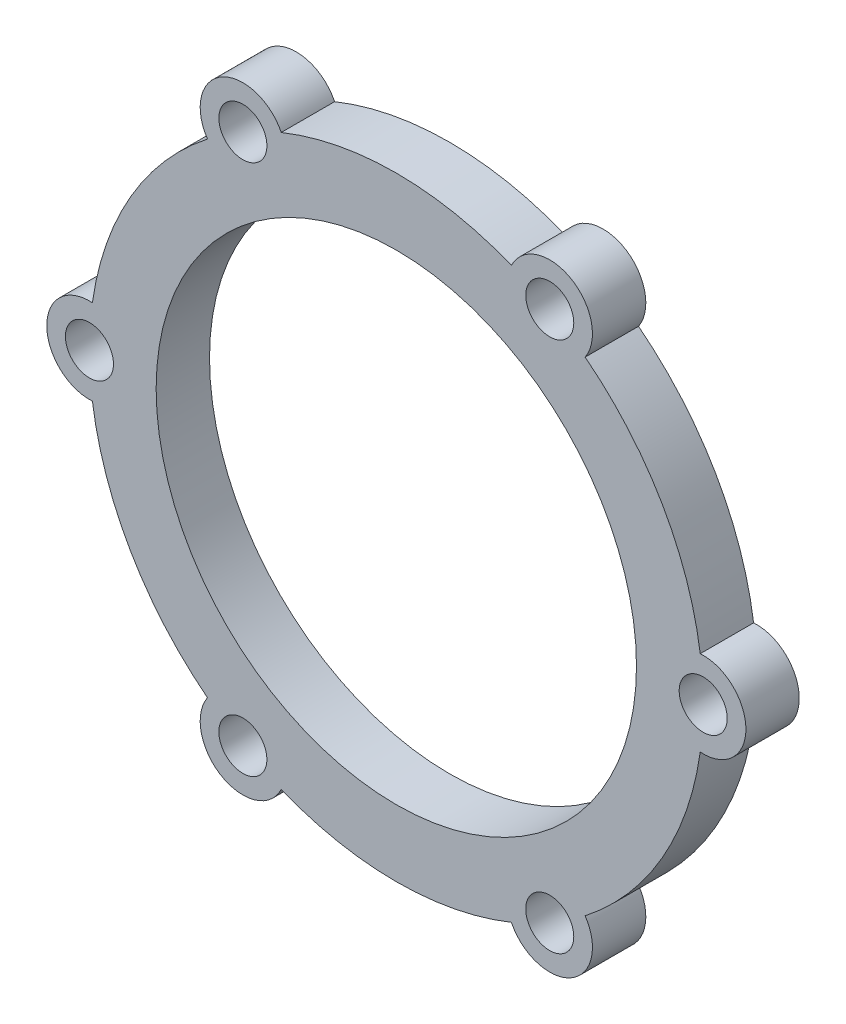
ISO-10303-21;
HEADER;
FILE_DESCRIPTION(('STEP AP214'),'2;1');
FILE_NAME('part.step','',(''),(''),'','','');
FILE_SCHEMA(('AUTOMOTIVE_DESIGN { 1 0 10303 214 1 1 1 1 }'));
ENDSEC;
DATA;
#1=APPLICATION_CONTEXT('core data for automotive mechanical design processes');
#2=APPLICATION_PROTOCOL_DEFINITION('international standard','automotive_design',2000,#1);
#3=PRODUCT_CONTEXT('',#1,'mechanical');
#4=PRODUCT('Part','Part','',(#3));
#5=PRODUCT_RELATED_PRODUCT_CATEGORY('part','',(#4));
#6=PRODUCT_DEFINITION_FORMATION('','',#4);
#7=PRODUCT_DEFINITION_CONTEXT('part definition',#1,'design');
#8=PRODUCT_DEFINITION('design','',#6,#7);
#9=PRODUCT_DEFINITION_SHAPE('','',#8);
#10=(LENGTH_UNIT() NAMED_UNIT(*) SI_UNIT(.MILLI.,.METRE.));
#11=(NAMED_UNIT(*) PLANE_ANGLE_UNIT() SI_UNIT($,.RADIAN.));
#12=(NAMED_UNIT(*) SI_UNIT($,.STERADIAN.) SOLID_ANGLE_UNIT());
#13=UNCERTAINTY_MEASURE_WITH_UNIT(LENGTH_MEASURE(1.E-05),#10,'distance_accuracy_value','');
#14=(GEOMETRIC_REPRESENTATION_CONTEXT(3) GLOBAL_UNCERTAINTY_ASSIGNED_CONTEXT((#13)) GLOBAL_UNIT_ASSIGNED_CONTEXT((#10,
#11,#12)) REPRESENTATION_CONTEXT('',''));
#15=CARTESIAN_POINT('',(0.,0.,0.));
#16=DIRECTION('',(0.,0.,1.));
#17=DIRECTION('',(1.,0.,0.));
#18=AXIS2_PLACEMENT_3D('',#15,#16,#17);
#19=CARTESIAN_POINT('',(-28.7500000000002,-49.7964607176051,10.));
#20=DIRECTION('',(0.,0.,-1.));
#21=DIRECTION('',(-1.,0.,0.));
#22=AXIS2_PLACEMENT_3D('',#19,#20,#21);
#23=CYLINDRICAL_SURFACE('',#22,7.99999999999999);
#24=CARTESIAN_POINT('',(-28.7500000000002,-49.7964607176051,0.));
#25=DIRECTION('',(0.,0.,1.));
#26=DIRECTION('',(1.,0.,0.));
#27=AXIS2_PLACEMENT_3D('',#24,#25,#26);
#28=CIRCLE('',#27,7.99999999999999);
#29=CARTESIAN_POINT('',(-35.3831581356326,-45.3241891306267,0.));
#30=VERTEX_POINT('',#29);
#31=CARTESIAN_POINT('',(-21.5603201252375,-53.304808376893,0.));
#32=VERTEX_POINT('',#31);
#33=EDGE_CURVE('E200',#30,#32,#28,.T.);
#34=ORIENTED_EDGE('',*,*,#33,.T.);
#35=DIRECTION('',(0.,0.,-1.));
#36=VECTOR('',#35,1.);
#37=CARTESIAN_POINT('',(-21.5603201252375,-53.304808376893,10.));
#38=LINE('',#37,#36);
#39=CARTESIAN_POINT('',(-21.5603201252375,-53.304808376893,10.));
#40=VERTEX_POINT('',#39);
#41=EDGE_CURVE('E11',#40,#32,#38,.T.);
#42=ORIENTED_EDGE('',*,*,#41,.F.);
#43=CARTESIAN_POINT('',(-28.7500000000002,-49.7964607176051,10.));
#44=DIRECTION('',(0.,0.,1.));
#45=DIRECTION('',(1.,0.,0.));
#46=AXIS2_PLACEMENT_3D('',#43,#44,#45);
#47=CIRCLE('',#46,7.99999999999999);
#48=CARTESIAN_POINT('',(-35.3831581356326,-45.3241891306267,10.));
#49=VERTEX_POINT('',#48);
#50=EDGE_CURVE('E326',#49,#40,#47,.T.);
#51=ORIENTED_EDGE('',*,*,#50,.F.);
#52=DIRECTION('',(0.,0.,-1.));
#53=VECTOR('',#52,1.);
#54=CARTESIAN_POINT('',(-35.3831581356326,-45.3241891306267,10.));
#55=LINE('',#54,#53);
#56=EDGE_CURVE('E179',#49,#30,#55,.T.);
#57=ORIENTED_EDGE('',*,*,#56,.T.);
#58=EDGE_LOOP('',(#34,#42,#51,#57));
#59=FACE_BOUND('',#58,.T.);
#60=ADVANCED_FACE('F45',(#59),#23,.T.);
#61=CARTESIAN_POINT('',(0.,0.,10.));
#62=DIRECTION('',(0.,0.,-1.));
#63=DIRECTION('',(-1.,0.,0.));
#64=AXIS2_PLACEMENT_3D('',#61,#62,#63);
#65=CYLINDRICAL_SURFACE('',#64,57.5);
#66=CARTESIAN_POINT('',(0.,0.,0.));
#67=DIRECTION('',(0.,0.,1.));
#68=DIRECTION('',(1.,0.,0.));
#69=AXIS2_PLACEMENT_3D('',#66,#67,#68);
#70=CIRCLE('',#69,57.5);
#71=CARTESIAN_POINT('',(21.560320125237,-53.3048083768932,0.));
#72=VERTEX_POINT('',#71);
#73=EDGE_CURVE('E204',#32,#72,#70,.T.);
#74=ORIENTED_EDGE('',*,*,#73,.T.);
#75=DIRECTION('',(0.,0.,-1.));
#76=VECTOR('',#75,1.);
#77=CARTESIAN_POINT('',(21.560320125237,-53.3048083768932,10.));
#78=LINE('',#77,#76);
#79=CARTESIAN_POINT('',(21.560320125237,-53.3048083768932,10.));
#80=VERTEX_POINT('',#79);
#81=EDGE_CURVE('E55',#80,#72,#78,.T.);
#82=ORIENTED_EDGE('',*,*,#81,.F.);
#83=CARTESIAN_POINT('',(0.,0.,10.));
#84=DIRECTION('',(0.,0.,1.));
#85=DIRECTION('',(1.,0.,0.));
#86=AXIS2_PLACEMENT_3D('',#83,#84,#85);
#87=CIRCLE('',#86,57.5);
#88=EDGE_CURVE('E118',#40,#80,#87,.T.);
#89=ORIENTED_EDGE('',*,*,#88,.F.);
#90=ORIENTED_EDGE('',*,*,#41,.T.);
#91=EDGE_LOOP('',(#74,#82,#89,#90));
#92=FACE_BOUND('',#91,.T.);
#93=ADVANCED_FACE('F343',(#92),#65,.T.);
#94=CARTESIAN_POINT('',(28.7499999999999,-49.7964607176053,10.));
#95=DIRECTION('',(0.,0.,-1.));
#96=DIRECTION('',(-1.,0.,0.));
#97=AXIS2_PLACEMENT_3D('',#94,#95,#96);
#98=CYLINDRICAL_SURFACE('',#97,8.00000000000003);
#99=CARTESIAN_POINT('',(28.7499999999999,-49.7964607176053,0.));
#100=DIRECTION('',(0.,0.,1.));
#101=DIRECTION('',(1.,0.,0.));
#102=AXIS2_PLACEMENT_3D('',#99,#100,#101);
#103=CIRCLE('',#102,8.00000000000003);
#104=CARTESIAN_POINT('',(35.3831581356323,-45.3241891306269,0.));
#105=VERTEX_POINT('',#104);
#106=EDGE_CURVE('E207',#72,#105,#103,.T.);
#107=ORIENTED_EDGE('',*,*,#106,.T.);
#108=DIRECTION('',(0.,0.,-1.));
#109=VECTOR('',#108,1.);
#110=CARTESIAN_POINT('',(35.3831581356323,-45.3241891306269,10.));
#111=LINE('',#110,#109);
#112=CARTESIAN_POINT('',(35.3831581356323,-45.3241891306269,10.));
#113=VERTEX_POINT('',#112);
#114=EDGE_CURVE('E269',#113,#105,#111,.T.);
#115=ORIENTED_EDGE('',*,*,#114,.F.);
#116=CARTESIAN_POINT('',(28.7499999999999,-49.7964607176053,10.));
#117=DIRECTION('',(0.,0.,1.));
#118=DIRECTION('',(1.,0.,0.));
#119=AXIS2_PLACEMENT_3D('',#116,#117,#118);
#120=CIRCLE('',#119,8.00000000000003);
#121=EDGE_CURVE('E279',#80,#113,#120,.T.);
#122=ORIENTED_EDGE('',*,*,#121,.F.);
#123=ORIENTED_EDGE('',*,*,#81,.T.);
#124=EDGE_LOOP('',(#107,#115,#122,#123));
#125=FACE_BOUND('',#124,.T.);
#126=ADVANCED_FACE('F277',(#125),#98,.T.);
#127=CARTESIAN_POINT('',(0.,0.,10.));
#128=DIRECTION('',(0.,0.,-1.));
#129=DIRECTION('',(-1.,0.,0.));
#130=AXIS2_PLACEMENT_3D('',#127,#128,#129);
#131=CYLINDRICAL_SURFACE('',#130,57.5);
#132=CARTESIAN_POINT('',(0.,0.,0.));
#133=DIRECTION('',(0.,0.,1.));
#134=DIRECTION('',(1.,0.,0.));
#135=AXIS2_PLACEMENT_3D('',#132,#133,#134);
#136=CIRCLE('',#135,57.5);
#137=CARTESIAN_POINT('',(56.9434782608696,-7.98061924626611,0.));
#138=VERTEX_POINT('',#137);
#139=EDGE_CURVE('E210',#105,#138,#136,.T.);
#140=ORIENTED_EDGE('',*,*,#139,.T.);
#141=DIRECTION('',(0.,0.,-1.));
#142=VECTOR('',#141,1.);
#143=CARTESIAN_POINT('',(56.9434782608696,-7.98061924626611,10.));
#144=LINE('',#143,#142);
#145=CARTESIAN_POINT('',(56.9434782608696,-7.98061924626611,10.));
#146=VERTEX_POINT('',#145);
#147=EDGE_CURVE('E265',#146,#138,#144,.T.);
#148=ORIENTED_EDGE('',*,*,#147,.F.);
#149=CARTESIAN_POINT('',(0.,0.,10.));
#150=DIRECTION('',(0.,0.,1.));
#151=DIRECTION('',(1.,0.,0.));
#152=AXIS2_PLACEMENT_3D('',#149,#150,#151);
#153=CIRCLE('',#152,57.5);
#154=EDGE_CURVE('E299',#113,#146,#153,.T.);
#155=ORIENTED_EDGE('',*,*,#154,.F.);
#156=ORIENTED_EDGE('',*,*,#114,.T.);
#157=EDGE_LOOP('',(#140,#148,#155,#156));
#158=FACE_BOUND('',#157,.T.);
#159=ADVANCED_FACE('F289',(#158),#131,.T.);
#160=CARTESIAN_POINT('',(57.5000000000015,-3.21617732446099E-12,10.));
#161=DIRECTION('',(0.,0.,-1.));
#162=DIRECTION('',(-1.,0.,0.));
#163=AXIS2_PLACEMENT_3D('',#160,#161,#162);
#164=CYLINDRICAL_SURFACE('',#163,7.99999999999676);
#165=CARTESIAN_POINT('',(57.5000000000015,-3.21617732446099E-12,0.));
#166=DIRECTION('',(0.,0.,1.));
#167=DIRECTION('',(1.,0.,0.));
#168=AXIS2_PLACEMENT_3D('',#165,#166,#167);
#169=CIRCLE('',#168,7.99999999999676);
#170=CARTESIAN_POINT('',(56.9434782608705,7.98061924625974,0.));
#171=VERTEX_POINT('',#170);
#172=EDGE_CURVE('E213',#138,#171,#169,.T.);
#173=ORIENTED_EDGE('',*,*,#172,.T.);
#174=DIRECTION('',(0.,0.,-1.));
#175=VECTOR('',#174,1.);
#176=CARTESIAN_POINT('',(56.9434782608705,7.98061924625974,10.));
#177=LINE('',#176,#175);
#178=CARTESIAN_POINT('',(56.9434782608705,7.98061924625974,10.));
#179=VERTEX_POINT('',#178);
#180=EDGE_CURVE('E261',#179,#171,#177,.T.);
#181=ORIENTED_EDGE('',*,*,#180,.F.);
#182=CARTESIAN_POINT('',(57.5000000000015,-3.21617732446099E-12,10.));
#183=DIRECTION('',(0.,0.,1.));
#184=DIRECTION('',(1.,0.,0.));
#185=AXIS2_PLACEMENT_3D('',#182,#183,#184);
#186=CIRCLE('',#185,7.99999999999676);
#187=EDGE_CURVE('E295',#146,#179,#186,.T.);
#188=ORIENTED_EDGE('',*,*,#187,.F.);
#189=ORIENTED_EDGE('',*,*,#147,.T.);
#190=EDGE_LOOP('',(#173,#181,#188,#189));
#191=FACE_BOUND('',#190,.T.);
#192=ADVANCED_FACE('F293',(#191),#164,.T.);
#193=CARTESIAN_POINT('',(0.,0.,10.));
#194=DIRECTION('',(0.,0.,-1.));
#195=DIRECTION('',(-1.,0.,0.));
#196=AXIS2_PLACEMENT_3D('',#193,#194,#195);
#197=CYLINDRICAL_SURFACE('',#196,57.5);
#198=CARTESIAN_POINT('',(0.,0.,0.));
#199=DIRECTION('',(0.,0.,1.));
#200=DIRECTION('',(1.,0.,0.));
#201=AXIS2_PLACEMENT_3D('',#198,#199,#200);
#202=CIRCLE('',#201,57.5);
#203=CARTESIAN_POINT('',(35.3831581356323,45.3241891306269,0.));
#204=VERTEX_POINT('',#203);
#205=EDGE_CURVE('E216',#171,#204,#202,.T.);
#206=ORIENTED_EDGE('',*,*,#205,.T.);
#207=DIRECTION('',(0.,0.,-1.));
#208=VECTOR('',#207,1.);
#209=CARTESIAN_POINT('',(35.3831581356323,45.3241891306269,10.));
#210=LINE('',#209,#208);
#211=CARTESIAN_POINT('',(35.3831581356323,45.3241891306269,10.));
#212=VERTEX_POINT('',#211);
#213=EDGE_CURVE('E257',#212,#204,#210,.T.);
#214=ORIENTED_EDGE('',*,*,#213,.F.);
#215=CARTESIAN_POINT('',(0.,0.,10.));
#216=DIRECTION('',(0.,0.,1.));
#217=DIRECTION('',(1.,0.,0.));
#218=AXIS2_PLACEMENT_3D('',#215,#216,#217);
#219=CIRCLE('',#218,57.5);
#220=EDGE_CURVE('E298',#179,#212,#219,.T.);
#221=ORIENTED_EDGE('',*,*,#220,.F.);
#222=ORIENTED_EDGE('',*,*,#180,.T.);
#223=EDGE_LOOP('',(#206,#214,#221,#222));
#224=FACE_BOUND('',#223,.T.);
#225=ADVANCED_FACE('F485',(#224),#197,.T.);
#226=CARTESIAN_POINT('',(28.7499999999999,49.7964607176053,10.));
#227=DIRECTION('',(0.,0.,-1.));
#228=DIRECTION('',(-1.,0.,0.));
#229=AXIS2_PLACEMENT_3D('',#226,#227,#228);
#230=CYLINDRICAL_SURFACE('',#229,8.00000000000005);
#231=CARTESIAN_POINT('',(28.7499999999999,49.7964607176053,0.));
#232=DIRECTION('',(0.,0.,1.));
#233=DIRECTION('',(1.,0.,0.));
#234=AXIS2_PLACEMENT_3D('',#231,#232,#233);
#235=CIRCLE('',#234,8.00000000000005);
#236=CARTESIAN_POINT('',(21.560320125237,53.3048083768932,0.));
#237=VERTEX_POINT('',#236);
#238=EDGE_CURVE('E219',#204,#237,#235,.T.);
#239=ORIENTED_EDGE('',*,*,#238,.T.);
#240=DIRECTION('',(0.,0.,-1.));
#241=VECTOR('',#240,1.);
#242=CARTESIAN_POINT('',(21.560320125237,53.3048083768932,10.));
#243=LINE('',#242,#241);
#244=CARTESIAN_POINT('',(21.560320125237,53.3048083768932,10.));
#245=VERTEX_POINT('',#244);
#246=EDGE_CURVE('E253',#245,#237,#243,.T.);
#247=ORIENTED_EDGE('',*,*,#246,.F.);
#248=CARTESIAN_POINT('',(28.7499999999999,49.7964607176053,10.));
#249=DIRECTION('',(0.,0.,1.));
#250=DIRECTION('',(1.,0.,0.));
#251=AXIS2_PLACEMENT_3D('',#248,#249,#250);
#252=CIRCLE('',#251,8.00000000000005);
#253=EDGE_CURVE('E303',#212,#245,#252,.T.);
#254=ORIENTED_EDGE('',*,*,#253,.F.);
#255=ORIENTED_EDGE('',*,*,#213,.T.);
#256=EDGE_LOOP('',(#239,#247,#254,#255));
#257=FACE_BOUND('',#256,.T.);
#258=ADVANCED_FACE('F477',(#257),#230,.T.);
#259=CARTESIAN_POINT('',(0.,0.,10.));
#260=DIRECTION('',(0.,0.,-1.));
#261=DIRECTION('',(-1.,0.,0.));
#262=AXIS2_PLACEMENT_3D('',#259,#260,#261);
#263=CYLINDRICAL_SURFACE('',#262,57.5);
#264=CARTESIAN_POINT('',(0.,0.,0.));
#265=DIRECTION('',(0.,0.,1.));
#266=DIRECTION('',(1.,0.,0.));
#267=AXIS2_PLACEMENT_3D('',#264,#265,#266);
#268=CIRCLE('',#267,57.5);
#269=CARTESIAN_POINT('',(-21.5603201252366,53.3048083768933,0.));
#270=VERTEX_POINT('',#269);
#271=EDGE_CURVE('E222',#237,#270,#268,.T.);
#272=ORIENTED_EDGE('',*,*,#271,.T.);
#273=DIRECTION('',(0.,0.,-1.));
#274=VECTOR('',#273,1.);
#275=CARTESIAN_POINT('',(-21.5603201252366,53.3048083768933,10.));
#276=LINE('',#275,#274);
#277=CARTESIAN_POINT('',(-21.5603201252366,53.3048083768933,10.));
#278=VERTEX_POINT('',#277);
#279=EDGE_CURVE('E249',#278,#270,#276,.T.);
#280=ORIENTED_EDGE('',*,*,#279,.F.);
#281=CARTESIAN_POINT('',(0.,0.,10.));
#282=DIRECTION('',(0.,0.,1.));
#283=DIRECTION('',(1.,0.,0.));
#284=AXIS2_PLACEMENT_3D('',#281,#282,#283);
#285=CIRCLE('',#284,57.5);
#286=EDGE_CURVE('E310',#245,#278,#285,.T.);
#287=ORIENTED_EDGE('',*,*,#286,.F.);
#288=ORIENTED_EDGE('',*,*,#246,.T.);
#289=EDGE_LOOP('',(#272,#280,#287,#288));
#290=FACE_BOUND('',#289,.T.);
#291=ADVANCED_FACE('F318',(#290),#263,.T.);
#292=CARTESIAN_POINT('',(-28.7499999999995,49.7964607176055,10.));
#293=DIRECTION('',(0.,0.,-1.));
#294=DIRECTION('',(-1.,0.,0.));
#295=AXIS2_PLACEMENT_3D('',#292,#293,#294);
#296=CYLINDRICAL_SURFACE('',#295,8.00000000000006);
#297=CARTESIAN_POINT('',(-28.7499999999995,49.7964607176055,0.));
#298=DIRECTION('',(0.,0.,1.));
#299=DIRECTION('',(1.,0.,0.));
#300=AXIS2_PLACEMENT_3D('',#297,#298,#299);
#301=CIRCLE('',#300,8.00000000000006);
#302=CARTESIAN_POINT('',(-35.383158135632,45.3241891306272,0.));
#303=VERTEX_POINT('',#302);
#304=EDGE_CURVE('E225',#270,#303,#301,.T.);
#305=ORIENTED_EDGE('',*,*,#304,.T.);
#306=DIRECTION('',(0.,0.,-1.));
#307=VECTOR('',#306,1.);
#308=CARTESIAN_POINT('',(-35.383158135632,45.3241891306272,10.));
#309=LINE('',#308,#307);
#310=CARTESIAN_POINT('',(-35.383158135632,45.3241891306272,10.));
#311=VERTEX_POINT('',#310);
#312=EDGE_CURVE('E161',#311,#303,#309,.T.);
#313=ORIENTED_EDGE('',*,*,#312,.F.);
#314=CARTESIAN_POINT('',(-28.7499999999995,49.7964607176055,10.));
#315=DIRECTION('',(0.,0.,1.));
#316=DIRECTION('',(1.,0.,0.));
#317=AXIS2_PLACEMENT_3D('',#314,#315,#316);
#318=CIRCLE('',#317,8.00000000000006);
#319=EDGE_CURVE('E150',#278,#311,#318,.T.);
#320=ORIENTED_EDGE('',*,*,#319,.F.);
#321=ORIENTED_EDGE('',*,*,#279,.T.);
#322=EDGE_LOOP('',(#305,#313,#320,#321));
#323=FACE_BOUND('',#322,.T.);
#324=ADVANCED_FACE('F322',(#323),#296,.T.);
#325=CARTESIAN_POINT('',(0.,0.,10.));
#326=DIRECTION('',(0.,0.,-1.));
#327=DIRECTION('',(-1.,0.,0.));
#328=AXIS2_PLACEMENT_3D('',#325,#326,#327);
#329=CYLINDRICAL_SURFACE('',#328,57.5);
#330=CARTESIAN_POINT('',(0.,0.,0.));
#331=DIRECTION('',(0.,0.,1.));
#332=DIRECTION('',(1.,0.,0.));
#333=AXIS2_PLACEMENT_3D('',#330,#331,#332);
#334=CIRCLE('',#333,57.5);
#335=CARTESIAN_POINT('',(-56.9434782608695,7.98061924626663,0.));
#336=VERTEX_POINT('',#335);
#337=EDGE_CURVE('E159',#303,#336,#334,.T.);
#338=ORIENTED_EDGE('',*,*,#337,.T.);
#339=DIRECTION('',(0.,0.,-1.));
#340=VECTOR('',#339,1.);
#341=CARTESIAN_POINT('',(-56.9434782608695,7.98061924626663,10.));
#342=LINE('',#341,#340);
#343=CARTESIAN_POINT('',(-56.9434782608695,7.98061924626663,10.));
#344=VERTEX_POINT('',#343);
#345=EDGE_CURVE('E156',#344,#336,#342,.T.);
#346=ORIENTED_EDGE('',*,*,#345,.F.);
#347=CARTESIAN_POINT('',(0.,0.,10.));
#348=DIRECTION('',(0.,0.,1.));
#349=DIRECTION('',(1.,0.,0.));
#350=AXIS2_PLACEMENT_3D('',#347,#348,#349);
#351=CIRCLE('',#350,57.5);
#352=EDGE_CURVE('E143',#311,#344,#351,.T.);
#353=ORIENTED_EDGE('',*,*,#352,.F.);
#354=ORIENTED_EDGE('',*,*,#312,.T.);
#355=EDGE_LOOP('',(#338,#346,#353,#354));
#356=FACE_BOUND('',#355,.T.);
#357=ADVANCED_FACE('F157',(#356),#329,.T.);
#358=CARTESIAN_POINT('',(-57.5,3.98986399474666E-13,10.));
#359=DIRECTION('',(0.,0.,-1.));
#360=DIRECTION('',(-1.,0.,0.));
#361=AXIS2_PLACEMENT_3D('',#358,#359,#360);
#362=CYLINDRICAL_SURFACE('',#361,7.99999999999999);
#363=CARTESIAN_POINT('',(-57.5,3.98986399474666E-13,0.));
#364=DIRECTION('',(0.,0.,1.));
#365=DIRECTION('',(1.,0.,0.));
#366=AXIS2_PLACEMENT_3D('',#363,#364,#365);
#367=CIRCLE('',#366,7.99999999999999);
#368=CARTESIAN_POINT('',(-56.9434782608696,-7.98061924626585,0.));
#369=VERTEX_POINT('',#368);
#370=EDGE_CURVE('E104',#336,#369,#367,.T.);
#371=ORIENTED_EDGE('',*,*,#370,.T.);
#372=DIRECTION('',(0.,0.,-1.));
#373=VECTOR('',#372,1.);
#374=CARTESIAN_POINT('',(-56.9434782608696,-7.98061924626585,10.));
#375=LINE('',#374,#373);
#376=CARTESIAN_POINT('',(-56.9434782608696,-7.98061924626585,10.));
#377=VERTEX_POINT('',#376);
#378=EDGE_CURVE('E162',#377,#369,#375,.T.);
#379=ORIENTED_EDGE('',*,*,#378,.F.);
#380=CARTESIAN_POINT('',(-57.5,3.98986399474666E-13,10.));
#381=DIRECTION('',(0.,0.,1.));
#382=DIRECTION('',(1.,0.,0.));
#383=AXIS2_PLACEMENT_3D('',#380,#381,#382);
#384=CIRCLE('',#383,7.99999999999999);
#385=EDGE_CURVE('E148',#344,#377,#384,.T.);
#386=ORIENTED_EDGE('',*,*,#385,.F.);
#387=ORIENTED_EDGE('',*,*,#345,.T.);
#388=EDGE_LOOP('',(#371,#379,#386,#387));
#389=FACE_BOUND('',#388,.T.);
#390=ADVANCED_FACE('F164',(#389),#362,.T.);
#391=CARTESIAN_POINT('',(57.5000000000015,-3.21617732446099E-12,10.));
#392=DIRECTION('',(0.,0.,-1.));
#393=DIRECTION('',(-1.,0.,0.));
#394=AXIS2_PLACEMENT_3D('',#391,#392,#393);
#395=CYLINDRICAL_SURFACE('',#394,4.49999999999672);
#396=CARTESIAN_POINT('',(57.5000000000015,-3.21617732446099E-12,10.));
#397=DIRECTION('',(0.,0.,1.));
#398=DIRECTION('',(1.,0.,0.));
#399=AXIS2_PLACEMENT_3D('',#396,#397,#398);
#400=CIRCLE('',#399,4.49999999999672);
#401=CARTESIAN_POINT('',(61.9999999999982,-3.21617732446099E-12,10.));
#402=VERTEX_POINT('',#401);
#403=EDGE_CURVE('E168',#402,#402,#400,.T.);
#404=ORIENTED_EDGE('',*,*,#403,.T.);
#405=EDGE_LOOP('',(#404));
#406=FACE_BOUND('',#405,.T.);
#407=CARTESIAN_POINT('',(57.5000000000015,-3.21617732446099E-12,0.));
#408=DIRECTION('',(0.,0.,1.));
#409=DIRECTION('',(1.,0.,0.));
#410=AXIS2_PLACEMENT_3D('',#407,#408,#409);
#411=CIRCLE('',#410,4.49999999999672);
#412=CARTESIAN_POINT('',(61.9999999999982,-3.21617732446099E-12,0.));
#413=VERTEX_POINT('',#412);
#414=EDGE_CURVE('E234',#413,#413,#411,.T.);
#415=ORIENTED_EDGE('',*,*,#414,.F.);
#416=EDGE_LOOP('',(#415));
#417=FACE_BOUND('',#416,.T.);
#418=ADVANCED_FACE('F330',(#406,#417),#395,.F.);
#419=CARTESIAN_POINT('',(0.,0.,10.));
#420=DIRECTION('',(0.,0.,-1.));
#421=DIRECTION('',(-1.,0.,0.));
#422=AXIS2_PLACEMENT_3D('',#419,#420,#421);
#423=CYLINDRICAL_SURFACE('',#422,57.5);
#424=CARTESIAN_POINT('',(0.,0.,0.));
#425=DIRECTION('',(0.,0.,1.));
#426=DIRECTION('',(1.,0.,0.));
#427=AXIS2_PLACEMENT_3D('',#424,#425,#426);
#428=CIRCLE('',#427,57.5);
#429=EDGE_CURVE('E110',#369,#30,#428,.T.);
#430=ORIENTED_EDGE('',*,*,#429,.T.);
#431=ORIENTED_EDGE('',*,*,#56,.F.);
#432=CARTESIAN_POINT('',(0.,0.,10.));
#433=DIRECTION('',(0.,0.,1.));
#434=DIRECTION('',(1.,0.,0.));
#435=AXIS2_PLACEMENT_3D('',#432,#433,#434);
#436=CIRCLE('',#435,57.5);
#437=EDGE_CURVE('E63',#377,#49,#436,.T.);
#438=ORIENTED_EDGE('',*,*,#437,.F.);
#439=ORIENTED_EDGE('',*,*,#378,.T.);
#440=EDGE_LOOP('',(#430,#431,#438,#439));
#441=FACE_BOUND('',#440,.T.);
#442=ADVANCED_FACE('F327',(#441),#423,.T.);
#443=CARTESIAN_POINT('',(-57.5,3.98986399474666E-13,10.));
#444=DIRECTION('',(0.,0.,-1.));
#445=DIRECTION('',(-1.,0.,0.));
#446=AXIS2_PLACEMENT_3D('',#443,#444,#445);
#447=CYLINDRICAL_SURFACE('',#446,4.5);
#448=CARTESIAN_POINT('',(-57.5,3.98986399474666E-13,10.));
#449=DIRECTION('',(0.,0.,1.));
#450=DIRECTION('',(1.,0.,0.));
#451=AXIS2_PLACEMENT_3D('',#448,#449,#450);
#452=CIRCLE('',#451,4.5);
#453=CARTESIAN_POINT('',(-53.,3.98986399474666E-13,10.));
#454=VERTEX_POINT('',#453);
#455=EDGE_CURVE('E558',#454,#454,#452,.T.);
#456=ORIENTED_EDGE('',*,*,#455,.T.);
#457=EDGE_LOOP('',(#456));
#458=FACE_BOUND('',#457,.T.);
#459=CARTESIAN_POINT('',(-57.5,3.98986399474666E-13,0.));
#460=DIRECTION('',(0.,0.,1.));
#461=DIRECTION('',(1.,0.,0.));
#462=AXIS2_PLACEMENT_3D('',#459,#460,#461);
#463=CIRCLE('',#462,4.5);
#464=CARTESIAN_POINT('',(-53.,3.98986399474666E-13,0.));
#465=VERTEX_POINT('',#464);
#466=EDGE_CURVE('E196',#465,#465,#463,.T.);
#467=ORIENTED_EDGE('',*,*,#466,.F.);
#468=EDGE_LOOP('',(#467));
#469=FACE_BOUND('',#468,.T.);
#470=ADVANCED_FACE('F329',(#458,#469),#447,.F.);
#471=CARTESIAN_POINT('',(-28.7499999999995,49.7964607176055,10.));
#472=DIRECTION('',(0.,0.,-1.));
#473=DIRECTION('',(-1.,0.,0.));
#474=AXIS2_PLACEMENT_3D('',#471,#472,#473);
#475=CYLINDRICAL_SURFACE('',#474,4.5);
#476=CARTESIAN_POINT('',(-28.7499999999995,49.7964607176055,10.));
#477=DIRECTION('',(0.,0.,1.));
#478=DIRECTION('',(1.,0.,0.));
#479=AXIS2_PLACEMENT_3D('',#476,#477,#478);
#480=CIRCLE('',#479,4.5);
#481=CARTESIAN_POINT('',(-24.2499999999995,49.7964607176055,10.));
#482=VERTEX_POINT('',#481);
#483=EDGE_CURVE('E555',#482,#482,#480,.T.);
#484=ORIENTED_EDGE('',*,*,#483,.T.);
#485=EDGE_LOOP('',(#484));
#486=FACE_BOUND('',#485,.T.);
#487=CARTESIAN_POINT('',(-28.7499999999995,49.7964607176055,0.));
#488=DIRECTION('',(0.,0.,1.));
#489=DIRECTION('',(1.,0.,0.));
#490=AXIS2_PLACEMENT_3D('',#487,#488,#489);
#491=CIRCLE('',#490,4.5);
#492=CARTESIAN_POINT('',(-24.2499999999995,49.7964607176055,0.));
#493=VERTEX_POINT('',#492);
#494=EDGE_CURVE('E192',#493,#493,#491,.T.);
#495=ORIENTED_EDGE('',*,*,#494,.F.);
#496=EDGE_LOOP('',(#495));
#497=FACE_BOUND('',#496,.T.);
#498=ADVANCED_FACE('F336',(#486,#497),#475,.F.);
#499=CARTESIAN_POINT('',(28.7499999999999,49.7964607176053,10.));
#500=DIRECTION('',(0.,0.,-1.));
#501=DIRECTION('',(-1.,0.,0.));
#502=AXIS2_PLACEMENT_3D('',#499,#500,#501);
#503=CYLINDRICAL_SURFACE('',#502,4.5);
#504=CARTESIAN_POINT('',(28.7499999999999,49.7964607176053,10.));
#505=DIRECTION('',(0.,0.,1.));
#506=DIRECTION('',(1.,0.,0.));
#507=AXIS2_PLACEMENT_3D('',#504,#505,#506);
#508=CIRCLE('',#507,4.5);
#509=CARTESIAN_POINT('',(33.2499999999999,49.7964607176053,10.));
#510=VERTEX_POINT('',#509);
#511=EDGE_CURVE('E551',#510,#510,#508,.T.);
#512=ORIENTED_EDGE('',*,*,#511,.T.);
#513=EDGE_LOOP('',(#512));
#514=FACE_BOUND('',#513,.T.);
#515=CARTESIAN_POINT('',(28.7499999999999,49.7964607176053,0.));
#516=DIRECTION('',(0.,0.,1.));
#517=DIRECTION('',(1.,0.,0.));
#518=AXIS2_PLACEMENT_3D('',#515,#516,#517);
#519=CIRCLE('',#518,4.5);
#520=CARTESIAN_POINT('',(33.2499999999999,49.7964607176053,0.));
#521=VERTEX_POINT('',#520);
#522=EDGE_CURVE('E188',#521,#521,#519,.T.);
#523=ORIENTED_EDGE('',*,*,#522,.F.);
#524=EDGE_LOOP('',(#523));
#525=FACE_BOUND('',#524,.T.);
#526=ADVANCED_FACE('F353',(#514,#525),#503,.F.);
#527=CARTESIAN_POINT('',(0.,0.,10.));
#528=DIRECTION('',(0.,0.,-1.));
#529=DIRECTION('',(-1.,0.,0.));
#530=AXIS2_PLACEMENT_3D('',#527,#528,#529);
#531=CYLINDRICAL_SURFACE('',#530,45.);
#532=CARTESIAN_POINT('',(0.,0.,10.));
#533=DIRECTION('',(0.,0.,1.));
#534=DIRECTION('',(1.,0.,0.));
#535=AXIS2_PLACEMENT_3D('',#532,#533,#534);
#536=CIRCLE('',#535,45.);
#537=CARTESIAN_POINT('',(45.,0.,10.));
#538=VERTEX_POINT('',#537);
#539=EDGE_CURVE('E368',#538,#538,#536,.T.);
#540=ORIENTED_EDGE('',*,*,#539,.T.);
#541=EDGE_LOOP('',(#540));
#542=FACE_BOUND('',#541,.T.);
#543=CARTESIAN_POINT('',(0.,0.,0.));
#544=DIRECTION('',(0.,0.,1.));
#545=DIRECTION('',(1.,0.,0.));
#546=AXIS2_PLACEMENT_3D('',#543,#544,#545);
#547=CIRCLE('',#546,45.);
#548=CARTESIAN_POINT('',(45.,0.,0.));
#549=VERTEX_POINT('',#548);
#550=EDGE_CURVE('E184',#549,#549,#547,.T.);
#551=ORIENTED_EDGE('',*,*,#550,.F.);
#552=EDGE_LOOP('',(#551));
#553=FACE_BOUND('',#552,.T.);
#554=ADVANCED_FACE('F356',(#542,#553),#531,.F.);
#555=CARTESIAN_POINT('',(-28.7500000000002,-49.7964607176051,10.));
#556=DIRECTION('',(0.,0.,-1.));
#557=DIRECTION('',(-1.,0.,0.));
#558=AXIS2_PLACEMENT_3D('',#555,#556,#557);
#559=CYLINDRICAL_SURFACE('',#558,4.5);
#560=CARTESIAN_POINT('',(-28.7500000000002,-49.7964607176051,10.));
#561=DIRECTION('',(0.,0.,1.));
#562=DIRECTION('',(1.,0.,0.));
#563=AXIS2_PLACEMENT_3D('',#560,#561,#562);
#564=CIRCLE('',#563,4.5);
#565=CARTESIAN_POINT('',(-24.2500000000002,-49.7964607176051,10.));
#566=VERTEX_POINT('',#565);
#567=EDGE_CURVE('E242',#566,#566,#564,.T.);
#568=ORIENTED_EDGE('',*,*,#567,.T.);
#569=EDGE_LOOP('',(#568));
#570=FACE_BOUND('',#569,.T.);
#571=CARTESIAN_POINT('',(-28.7500000000002,-49.7964607176051,0.));
#572=DIRECTION('',(0.,0.,1.));
#573=DIRECTION('',(1.,0.,0.));
#574=AXIS2_PLACEMENT_3D('',#571,#572,#573);
#575=CIRCLE('',#574,4.5);
#576=CARTESIAN_POINT('',(-24.2500000000002,-49.7964607176051,0.));
#577=VERTEX_POINT('',#576);
#578=EDGE_CURVE('E180',#577,#577,#575,.T.);
#579=ORIENTED_EDGE('',*,*,#578,.F.);
#580=EDGE_LOOP('',(#579));
#581=FACE_BOUND('',#580,.T.);
#582=ADVANCED_FACE('F47',(#570,#581),#559,.F.);
#583=CARTESIAN_POINT('',(28.7499999999999,-49.7964607176053,10.));
#584=DIRECTION('',(0.,0.,-1.));
#585=DIRECTION('',(-1.,0.,0.));
#586=AXIS2_PLACEMENT_3D('',#583,#584,#585);
#587=CYLINDRICAL_SURFACE('',#586,4.5);
#588=CARTESIAN_POINT('',(28.7499999999999,-49.7964607176053,10.));
#589=DIRECTION('',(0.,0.,1.));
#590=DIRECTION('',(1.,0.,0.));
#591=AXIS2_PLACEMENT_3D('',#588,#589,#590);
#592=CIRCLE('',#591,4.5);
#593=CARTESIAN_POINT('',(33.2499999999999,-49.7964607176053,10.));
#594=VERTEX_POINT('',#593);
#595=EDGE_CURVE('E175',#594,#594,#592,.T.);
#596=ORIENTED_EDGE('',*,*,#595,.T.);
#597=EDGE_LOOP('',(#596));
#598=FACE_BOUND('',#597,.T.);
#599=CARTESIAN_POINT('',(28.7499999999999,-49.7964607176053,0.));
#600=DIRECTION('',(0.,0.,1.));
#601=DIRECTION('',(1.,0.,0.));
#602=AXIS2_PLACEMENT_3D('',#599,#600,#601);
#603=CIRCLE('',#602,4.5);
#604=CARTESIAN_POINT('',(33.2499999999999,-49.7964607176053,0.));
#605=VERTEX_POINT('',#604);
#606=EDGE_CURVE('E238',#605,#605,#603,.T.);
#607=ORIENTED_EDGE('',*,*,#606,.F.);
#608=EDGE_LOOP('',(#607));
#609=FACE_BOUND('',#608,.T.);
#610=ADVANCED_FACE('F363',(#598,#609),#587,.F.);
#611=CARTESIAN_POINT('',(0.,0.,10.));
#612=DIRECTION('',(0.,0.,1.));
#613=DIRECTION('',(1.,0.,0.));
#614=AXIS2_PLACEMENT_3D('',#611,#612,#613);
#615=PLANE('',#614);
#616=ORIENTED_EDGE('',*,*,#567,.F.);
#617=EDGE_LOOP('',(#616));
#618=FACE_BOUND('',#617,.T.);
#619=ORIENTED_EDGE('',*,*,#539,.F.);
#620=EDGE_LOOP('',(#619));
#621=FACE_BOUND('',#620,.T.);
#622=ORIENTED_EDGE('',*,*,#511,.F.);
#623=EDGE_LOOP('',(#622));
#624=FACE_BOUND('',#623,.T.);
#625=ORIENTED_EDGE('',*,*,#483,.F.);
#626=EDGE_LOOP('',(#625));
#627=FACE_BOUND('',#626,.T.);
#628=ORIENTED_EDGE('',*,*,#455,.F.);
#629=EDGE_LOOP('',(#628));
#630=FACE_BOUND('',#629,.T.);
#631=ORIENTED_EDGE('',*,*,#50,.T.);
#632=ORIENTED_EDGE('',*,*,#88,.T.);
#633=ORIENTED_EDGE('',*,*,#121,.T.);
#634=ORIENTED_EDGE('',*,*,#154,.T.);
#635=ORIENTED_EDGE('',*,*,#187,.T.);
#636=ORIENTED_EDGE('',*,*,#220,.T.);
#637=ORIENTED_EDGE('',*,*,#253,.T.);
#638=ORIENTED_EDGE('',*,*,#286,.T.);
#639=ORIENTED_EDGE('',*,*,#319,.T.);
#640=ORIENTED_EDGE('',*,*,#352,.T.);
#641=ORIENTED_EDGE('',*,*,#385,.T.);
#642=ORIENTED_EDGE('',*,*,#437,.T.);
#643=EDGE_LOOP('',(#631,#632,#633,#634,#635,#636,#637,#638,#639,#640,#641,#642));
#644=FACE_BOUND('',#643,.T.);
#645=ORIENTED_EDGE('',*,*,#403,.F.);
#646=EDGE_LOOP('',(#645));
#647=FACE_BOUND('',#646,.T.);
#648=ORIENTED_EDGE('',*,*,#595,.F.);
#649=EDGE_LOOP('',(#648));
#650=FACE_BOUND('',#649,.T.);
#651=ADVANCED_FACE('F145',(#618,#621,#624,#627,#630,#644,#647,#650),#615,.T.);
#652=CARTESIAN_POINT('',(0.,0.,0.));
#653=DIRECTION('',(0.,0.,1.));
#654=DIRECTION('',(1.,0.,0.));
#655=AXIS2_PLACEMENT_3D('',#652,#653,#654);
#656=PLANE('',#655);
#657=ORIENTED_EDGE('',*,*,#578,.T.);
#658=EDGE_LOOP('',(#657));
#659=FACE_BOUND('',#658,.T.);
#660=ORIENTED_EDGE('',*,*,#550,.T.);
#661=EDGE_LOOP('',(#660));
#662=FACE_BOUND('',#661,.T.);
#663=ORIENTED_EDGE('',*,*,#522,.T.);
#664=EDGE_LOOP('',(#663));
#665=FACE_BOUND('',#664,.T.);
#666=ORIENTED_EDGE('',*,*,#494,.T.);
#667=EDGE_LOOP('',(#666));
#668=FACE_BOUND('',#667,.T.);
#669=ORIENTED_EDGE('',*,*,#466,.T.);
#670=EDGE_LOOP('',(#669));
#671=FACE_BOUND('',#670,.T.);
#672=ORIENTED_EDGE('',*,*,#33,.F.);
#673=ORIENTED_EDGE('',*,*,#429,.F.);
#674=ORIENTED_EDGE('',*,*,#370,.F.);
#675=ORIENTED_EDGE('',*,*,#337,.F.);
#676=ORIENTED_EDGE('',*,*,#304,.F.);
#677=ORIENTED_EDGE('',*,*,#271,.F.);
#678=ORIENTED_EDGE('',*,*,#238,.F.);
#679=ORIENTED_EDGE('',*,*,#205,.F.);
#680=ORIENTED_EDGE('',*,*,#172,.F.);
#681=ORIENTED_EDGE('',*,*,#139,.F.);
#682=ORIENTED_EDGE('',*,*,#106,.F.);
#683=ORIENTED_EDGE('',*,*,#73,.F.);
#684=EDGE_LOOP('',(#672,#673,#674,#675,#676,#677,#678,#679,#680,#681,#682,#683));
#685=FACE_BOUND('',#684,.T.);
#686=ORIENTED_EDGE('',*,*,#414,.T.);
#687=EDGE_LOOP('',(#686));
#688=FACE_BOUND('',#687,.T.);
#689=ORIENTED_EDGE('',*,*,#606,.T.);
#690=EDGE_LOOP('',(#689));
#691=FACE_BOUND('',#690,.T.);
#692=ADVANCED_FACE('F283',(#659,#662,#665,#668,#671,#685,#688,#691),#656,.F.);
#693=CLOSED_SHELL('',(#60,#93,#126,#159,#192,#225,#258,#291,#324,#357,#390,#418,#442,#470,#498,
#526,#554,#582,#610,#651,#692));
#694=MANIFOLD_SOLID_BREP('B2',#693);
#695=ADVANCED_BREP_SHAPE_REPRESENTATION('',(#18,#694),#14);
#696=SHAPE_DEFINITION_REPRESENTATION(#9,#695);
ENDSEC;
END-ISO-10303-21;
